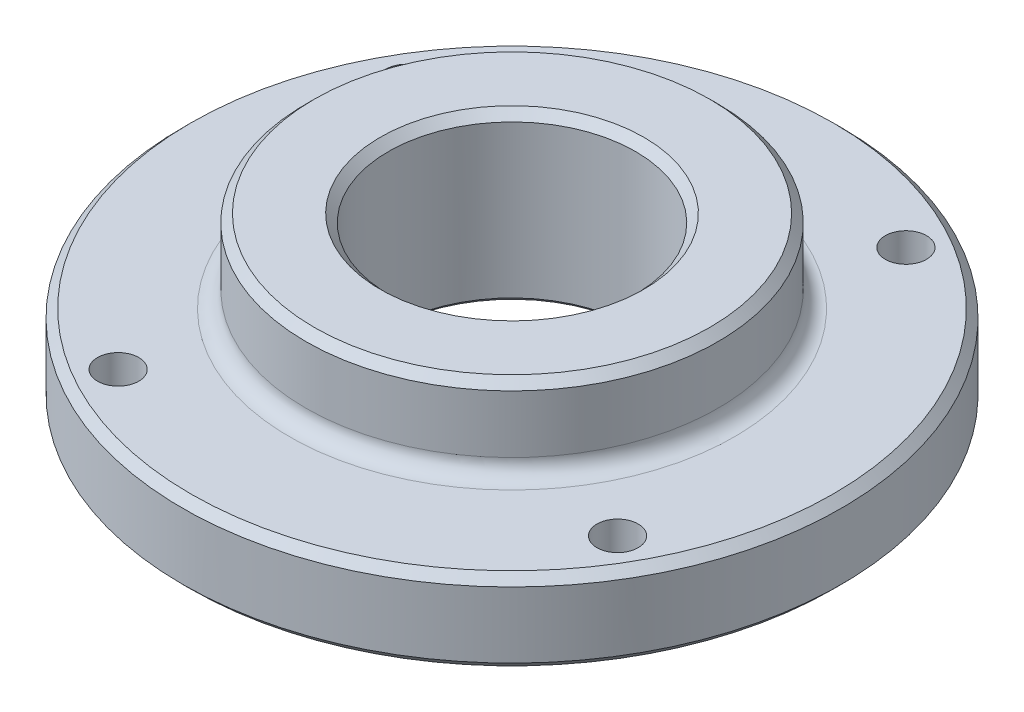
ISO-10303-21;
HEADER;
FILE_DESCRIPTION(('STEP AP214'),'2;1');
FILE_NAME('part.step','',(''),(''),'','','');
FILE_SCHEMA(('AUTOMOTIVE_DESIGN { 1 0 10303 214 1 1 1 1 }'));
ENDSEC;
DATA;
#1=APPLICATION_CONTEXT('core data for automotive mechanical design processes');
#2=APPLICATION_PROTOCOL_DEFINITION('international standard','automotive_design',2000,#1);
#3=PRODUCT_CONTEXT('',#1,'mechanical');
#4=PRODUCT('Part','Part','',(#3));
#5=PRODUCT_RELATED_PRODUCT_CATEGORY('part','',(#4));
#6=PRODUCT_DEFINITION_FORMATION('','',#4);
#7=PRODUCT_DEFINITION_CONTEXT('part definition',#1,'design');
#8=PRODUCT_DEFINITION('design','',#6,#7);
#9=PRODUCT_DEFINITION_SHAPE('','',#8);
#10=(LENGTH_UNIT() NAMED_UNIT(*) SI_UNIT(.MILLI.,.METRE.));
#11=(NAMED_UNIT(*) PLANE_ANGLE_UNIT() SI_UNIT($,.RADIAN.));
#12=(NAMED_UNIT(*) SI_UNIT($,.STERADIAN.) SOLID_ANGLE_UNIT());
#13=UNCERTAINTY_MEASURE_WITH_UNIT(LENGTH_MEASURE(1.E-05),#10,'distance_accuracy_value','');
#14=(GEOMETRIC_REPRESENTATION_CONTEXT(3) GLOBAL_UNCERTAINTY_ASSIGNED_CONTEXT((#13)) GLOBAL_UNIT_ASSIGNED_CONTEXT((#10,
#11,#12)) REPRESENTATION_CONTEXT('',''));
#15=CARTESIAN_POINT('',(0.,0.,0.));
#16=DIRECTION('',(0.,0.,1.));
#17=DIRECTION('',(1.,0.,0.));
#18=AXIS2_PLACEMENT_3D('',#15,#16,#17);
#19=CARTESIAN_POINT('',(-40.,0.,0.));
#20=DIRECTION('',(0.,1.,0.));
#21=DIRECTION('',(0.,0.,1.));
#22=AXIS2_PLACEMENT_3D('',#19,#20,#21);
#23=PLANE('',#22);
#24=CARTESIAN_POINT('',(0.,0.,0.));
#25=DIRECTION('',(0.,1.,0.));
#26=DIRECTION('',(0.,0.,1.));
#27=AXIS2_PLACEMENT_3D('',#24,#25,#26);
#28=CIRCLE('',#27,15.5);
#29=CARTESIAN_POINT('',(0.,0.,15.5));
#30=VERTEX_POINT('',#29);
#31=EDGE_CURVE('E10',#30,#30,#28,.T.);
#32=ORIENTED_EDGE('',*,*,#31,.T.);
#33=EDGE_LOOP('',(#32));
#34=FACE_BOUND('',#33,.T.);
#35=CARTESIAN_POINT('',(0.,0.,0.));
#36=DIRECTION('',(0.,1.,0.));
#37=DIRECTION('',(0.,0.,1.));
#38=AXIS2_PLACEMENT_3D('',#35,#36,#37);
#39=CIRCLE('',#38,39.);
#40=CARTESIAN_POINT('',(0.,0.,39.));
#41=VERTEX_POINT('',#40);
#42=EDGE_CURVE('E67',#41,#41,#39,.F.);
#43=ORIENTED_EDGE('',*,*,#42,.T.);
#44=EDGE_LOOP('',(#43));
#45=FACE_BOUND('',#44,.T.);
#46=CARTESIAN_POINT('',(17.5,0.,-30.3108891324553));
#47=DIRECTION('',(0.,1.,0.));
#48=DIRECTION('',(0.,0.,1.));
#49=AXIS2_PLACEMENT_3D('',#46,#47,#48);
#50=CIRCLE('',#49,2.5);
#51=CARTESIAN_POINT('',(17.5,0.,-27.8108891324553));
#52=VERTEX_POINT('',#51);
#53=EDGE_CURVE('E99',#52,#52,#50,.F.);
#54=ORIENTED_EDGE('',*,*,#53,.F.);
#55=EDGE_LOOP('',(#54));
#56=FACE_BOUND('',#55,.T.);
#57=CARTESIAN_POINT('',(30.3108891324567,0.,17.4999999999997));
#58=DIRECTION('',(0.,1.,0.));
#59=DIRECTION('',(0.,0.,1.));
#60=AXIS2_PLACEMENT_3D('',#57,#58,#59);
#61=CIRCLE('',#60,2.50000000000005);
#62=CARTESIAN_POINT('',(30.3108891324567,0.,19.9999999999997));
#63=VERTEX_POINT('',#62);
#64=EDGE_CURVE('E113',#63,#63,#61,.F.);
#65=ORIENTED_EDGE('',*,*,#64,.F.);
#66=EDGE_LOOP('',(#65));
#67=FACE_BOUND('',#66,.T.);
#68=CARTESIAN_POINT('',(-17.4999999999983,0.,30.3108891324563));
#69=DIRECTION('',(0.,1.,0.));
#70=DIRECTION('',(0.,0.,1.));
#71=AXIS2_PLACEMENT_3D('',#68,#69,#70);
#72=CIRCLE('',#71,2.50000000000152);
#73=CARTESIAN_POINT('',(-17.4999999999983,0.,32.8108891324578));
#74=VERTEX_POINT('',#73);
#75=EDGE_CURVE('E104',#74,#74,#72,.F.);
#76=ORIENTED_EDGE('',*,*,#75,.F.);
#77=EDGE_LOOP('',(#76));
#78=FACE_BOUND('',#77,.T.);
#79=CARTESIAN_POINT('',(-30.310889132455,0.,-17.4999999999987));
#80=DIRECTION('',(0.,1.,0.));
#81=DIRECTION('',(0.,0.,1.));
#82=AXIS2_PLACEMENT_3D('',#79,#80,#81);
#83=CIRCLE('',#82,2.50000000000165);
#84=CARTESIAN_POINT('',(-30.310889132455,0.,-14.999999999997));
#85=VERTEX_POINT('',#84);
#86=EDGE_CURVE('E105',#85,#85,#83,.F.);
#87=ORIENTED_EDGE('',*,*,#86,.F.);
#88=EDGE_LOOP('',(#87));
#89=FACE_BOUND('',#88,.T.);
#90=ADVANCED_FACE('F42',(#34,#45,#56,#67,#78,#89),#23,.F.);
#91=CARTESIAN_POINT('',(0.,0.,0.));
#92=DIRECTION('',(0.,-1.,0.));
#93=DIRECTION('',(0.,0.,-1.));
#94=AXIS2_PLACEMENT_3D('',#91,#92,#93);
#95=CYLINDRICAL_SURFACE('',#94,15.);
#96=CARTESIAN_POINT('',(0.,0.499999999999999,0.));
#97=DIRECTION('',(0.,1.,0.));
#98=DIRECTION('',(0.,0.,1.));
#99=AXIS2_PLACEMENT_3D('',#96,#97,#98);
#100=CIRCLE('',#99,15.);
#101=CARTESIAN_POINT('',(0.,0.499999999999999,15.));
#102=VERTEX_POINT('',#101);
#103=EDGE_CURVE('E51',#102,#102,#100,.F.);
#104=ORIENTED_EDGE('',*,*,#103,.T.);
#105=EDGE_LOOP('',(#104));
#106=FACE_BOUND('',#105,.T.);
#107=CARTESIAN_POINT('',(0.,19.,0.));
#108=DIRECTION('',(0.,-1.,0.));
#109=DIRECTION('',(0.,0.,-1.));
#110=AXIS2_PLACEMENT_3D('',#107,#108,#109);
#111=CIRCLE('',#110,15.);
#112=CARTESIAN_POINT('',(0.,19.,-15.));
#113=VERTEX_POINT('',#112);
#114=EDGE_CURVE('E91',#113,#113,#111,.F.);
#115=ORIENTED_EDGE('',*,*,#114,.T.);
#116=EDGE_LOOP('',(#115));
#117=FACE_BOUND('',#116,.T.);
#118=ADVANCED_FACE('F157',(#106,#117),#95,.F.);
#119=CARTESIAN_POINT('',(-15.,20.,0.));
#120=DIRECTION('',(0.,-1.,0.));
#121=DIRECTION('',(0.,0.,-1.));
#122=AXIS2_PLACEMENT_3D('',#119,#120,#121);
#123=PLANE('',#122);
#124=CARTESIAN_POINT('',(0.,20.,0.));
#125=DIRECTION('',(0.,-1.,0.));
#126=DIRECTION('',(0.,0.,-1.));
#127=AXIS2_PLACEMENT_3D('',#124,#125,#126);
#128=CIRCLE('',#127,24.);
#129=CARTESIAN_POINT('',(0.,20.,-24.));
#130=VERTEX_POINT('',#129);
#131=EDGE_CURVE('E56',#130,#130,#128,.F.);
#132=ORIENTED_EDGE('',*,*,#131,.T.);
#133=EDGE_LOOP('',(#132));
#134=FACE_BOUND('',#133,.T.);
#135=CARTESIAN_POINT('',(0.,20.,0.));
#136=DIRECTION('',(0.,-1.,0.));
#137=DIRECTION('',(0.,0.,-1.));
#138=AXIS2_PLACEMENT_3D('',#135,#136,#137);
#139=CIRCLE('',#138,16.);
#140=CARTESIAN_POINT('',(0.,20.,-16.));
#141=VERTEX_POINT('',#140);
#142=EDGE_CURVE('E95',#141,#141,#139,.T.);
#143=ORIENTED_EDGE('',*,*,#142,.T.);
#144=EDGE_LOOP('',(#143));
#145=FACE_BOUND('',#144,.T.);
#146=ADVANCED_FACE('F162',(#134,#145),#123,.F.);
#147=CARTESIAN_POINT('',(0.,0.,0.));
#148=DIRECTION('',(0.,-1.,0.));
#149=DIRECTION('',(0.,0.,-1.));
#150=AXIS2_PLACEMENT_3D('',#147,#148,#149);
#151=CYLINDRICAL_SURFACE('',#150,25.);
#152=CARTESIAN_POINT('',(0.,19.,0.));
#153=DIRECTION('',(0.,-1.,0.));
#154=DIRECTION('',(0.,0.,-1.));
#155=AXIS2_PLACEMENT_3D('',#152,#153,#154);
#156=CIRCLE('',#155,25.);
#157=CARTESIAN_POINT('',(0.,19.,-25.));
#158=VERTEX_POINT('',#157);
#159=EDGE_CURVE('E61',#158,#158,#156,.T.);
#160=ORIENTED_EDGE('',*,*,#159,.T.);
#161=EDGE_LOOP('',(#160));
#162=FACE_BOUND('',#161,.T.);
#163=CARTESIAN_POINT('',(0.,12.,0.));
#164=DIRECTION('',(0.,-1.,0.));
#165=DIRECTION('',(0.,0.,-1.));
#166=AXIS2_PLACEMENT_3D('',#163,#164,#165);
#167=CIRCLE('',#166,25.);
#168=CARTESIAN_POINT('',(0.,12.,-25.));
#169=VERTEX_POINT('',#168);
#170=EDGE_CURVE('E83',#169,#169,#167,.F.);
#171=ORIENTED_EDGE('',*,*,#170,.T.);
#172=EDGE_LOOP('',(#171));
#173=FACE_BOUND('',#172,.T.);
#174=ADVANCED_FACE('F139',(#162,#173),#151,.T.);
#175=CARTESIAN_POINT('',(-25.,10.,0.));
#176=DIRECTION('',(0.,-1.,0.));
#177=DIRECTION('',(0.,0.,-1.));
#178=AXIS2_PLACEMENT_3D('',#175,#176,#177);
#179=PLANE('',#178);
#180=CARTESIAN_POINT('',(0.,10.,0.));
#181=DIRECTION('',(0.,-1.,0.));
#182=DIRECTION('',(0.,0.,-1.));
#183=AXIS2_PLACEMENT_3D('',#180,#181,#182);
#184=CIRCLE('',#183,39.);
#185=CARTESIAN_POINT('',(0.,10.,-39.));
#186=VERTEX_POINT('',#185);
#187=EDGE_CURVE('E71',#186,#186,#184,.F.);
#188=ORIENTED_EDGE('',*,*,#187,.T.);
#189=EDGE_LOOP('',(#188));
#190=FACE_BOUND('',#189,.T.);
#191=CARTESIAN_POINT('',(0.,10.,0.));
#192=DIRECTION('',(0.,-1.,0.));
#193=DIRECTION('',(0.,0.,-1.));
#194=AXIS2_PLACEMENT_3D('',#191,#192,#193);
#195=CIRCLE('',#194,27.);
#196=CARTESIAN_POINT('',(0.,10.,-27.));
#197=VERTEX_POINT('',#196);
#198=EDGE_CURVE('E87',#197,#197,#195,.T.);
#199=ORIENTED_EDGE('',*,*,#198,.T.);
#200=EDGE_LOOP('',(#199));
#201=FACE_BOUND('',#200,.T.);
#202=CARTESIAN_POINT('',(17.5,10.,-30.3108891324553));
#203=DIRECTION('',(0.,1.,0.));
#204=DIRECTION('',(0.,0.,1.));
#205=AXIS2_PLACEMENT_3D('',#202,#203,#204);
#206=CIRCLE('',#205,2.5);
#207=CARTESIAN_POINT('',(17.5,10.,-27.8108891324553));
#208=VERTEX_POINT('',#207);
#209=EDGE_CURVE('E121',#208,#208,#206,.T.);
#210=ORIENTED_EDGE('',*,*,#209,.F.);
#211=EDGE_LOOP('',(#210));
#212=FACE_BOUND('',#211,.T.);
#213=CARTESIAN_POINT('',(30.3108891324567,10.,17.4999999999997));
#214=DIRECTION('',(0.,1.,0.));
#215=DIRECTION('',(0.,0.,1.));
#216=AXIS2_PLACEMENT_3D('',#213,#214,#215);
#217=CIRCLE('',#216,2.50000000000005);
#218=CARTESIAN_POINT('',(30.3108891324567,10.,19.9999999999997));
#219=VERTEX_POINT('',#218);
#220=EDGE_CURVE('E117',#219,#219,#217,.T.);
#221=ORIENTED_EDGE('',*,*,#220,.F.);
#222=EDGE_LOOP('',(#221));
#223=FACE_BOUND('',#222,.T.);
#224=CARTESIAN_POINT('',(-17.4999999999983,10.,30.3108891324563));
#225=DIRECTION('',(0.,1.,0.));
#226=DIRECTION('',(0.,0.,1.));
#227=AXIS2_PLACEMENT_3D('',#224,#225,#226);
#228=CIRCLE('',#227,2.50000000000152);
#229=CARTESIAN_POINT('',(-17.4999999999983,10.,32.8108891324578));
#230=VERTEX_POINT('',#229);
#231=EDGE_CURVE('E109',#230,#230,#228,.T.);
#232=ORIENTED_EDGE('',*,*,#231,.F.);
#233=EDGE_LOOP('',(#232));
#234=FACE_BOUND('',#233,.T.);
#235=CARTESIAN_POINT('',(-30.310889132455,10.,-17.4999999999987));
#236=DIRECTION('',(0.,1.,0.));
#237=DIRECTION('',(0.,0.,1.));
#238=AXIS2_PLACEMENT_3D('',#235,#236,#237);
#239=CIRCLE('',#238,2.50000000000165);
#240=CARTESIAN_POINT('',(-30.310889132455,10.,-14.999999999997));
#241=VERTEX_POINT('',#240);
#242=EDGE_CURVE('E100',#241,#241,#239,.T.);
#243=ORIENTED_EDGE('',*,*,#242,.F.);
#244=EDGE_LOOP('',(#243));
#245=FACE_BOUND('',#244,.T.);
#246=ADVANCED_FACE('F135',(#190,#201,#212,#223,#234,#245),#179,.F.);
#247=CARTESIAN_POINT('',(0.,0.,0.));
#248=DIRECTION('',(0.,-1.,0.));
#249=DIRECTION('',(0.,0.,-1.));
#250=AXIS2_PLACEMENT_3D('',#247,#248,#249);
#251=CYLINDRICAL_SURFACE('',#250,40.);
#252=CARTESIAN_POINT('',(0.,9.00000000000001,0.));
#253=DIRECTION('',(0.,-1.,0.));
#254=DIRECTION('',(0.,0.,-1.));
#255=AXIS2_PLACEMENT_3D('',#252,#253,#254);
#256=CIRCLE('',#255,40.);
#257=CARTESIAN_POINT('',(0.,9.00000000000001,-40.));
#258=VERTEX_POINT('',#257);
#259=EDGE_CURVE('E75',#258,#258,#256,.T.);
#260=ORIENTED_EDGE('',*,*,#259,.T.);
#261=EDGE_LOOP('',(#260));
#262=FACE_BOUND('',#261,.T.);
#263=CARTESIAN_POINT('',(0.,1.00000000000002,0.));
#264=DIRECTION('',(0.,1.,0.));
#265=DIRECTION('',(0.,0.,1.));
#266=AXIS2_PLACEMENT_3D('',#263,#264,#265);
#267=CIRCLE('',#266,40.);
#268=CARTESIAN_POINT('',(0.,1.00000000000002,40.));
#269=VERTEX_POINT('',#268);
#270=EDGE_CURVE('E79',#269,#269,#267,.T.);
#271=ORIENTED_EDGE('',*,*,#270,.T.);
#272=EDGE_LOOP('',(#271));
#273=FACE_BOUND('',#272,.T.);
#274=ADVANCED_FACE('F138',(#262,#273),#251,.T.);
#275=CARTESIAN_POINT('',(0.,20.,0.));
#276=DIRECTION('',(0.,1.,0.));
#277=DIRECTION('',(0.,0.,1.));
#278=AXIS2_PLACEMENT_3D('',#275,#276,#277);
#279=CONICAL_SURFACE('',#278,16.,0.785398163397453);
#280=ORIENTED_EDGE('',*,*,#114,.F.);
#281=EDGE_LOOP('',(#280));
#282=FACE_BOUND('',#281,.T.);
#283=ORIENTED_EDGE('',*,*,#142,.F.);
#284=EDGE_LOOP('',(#283));
#285=FACE_BOUND('',#284,.T.);
#286=ADVANCED_FACE('F152',(#282,#285),#279,.F.);
#287=CARTESIAN_POINT('',(-30.310889132455,-0.000999999999999265,-17.4999999999987));
#288=DIRECTION('',(0.,1.,0.));
#289=DIRECTION('',(0.,0.,1.));
#290=AXIS2_PLACEMENT_3D('',#287,#288,#289);
#291=CYLINDRICAL_SURFACE('',#290,2.50000000000165);
#292=ORIENTED_EDGE('',*,*,#242,.T.);
#293=EDGE_LOOP('',(#292));
#294=FACE_BOUND('',#293,.T.);
#295=ORIENTED_EDGE('',*,*,#86,.T.);
#296=EDGE_LOOP('',(#295));
#297=FACE_BOUND('',#296,.T.);
#298=ADVANCED_FACE('F148',(#294,#297),#291,.F.);
#299=CARTESIAN_POINT('',(-17.4999999999983,-0.000999999999999265,30.3108891324563));
#300=DIRECTION('',(0.,1.,0.));
#301=DIRECTION('',(0.,0.,1.));
#302=AXIS2_PLACEMENT_3D('',#299,#300,#301);
#303=CYLINDRICAL_SURFACE('',#302,2.50000000000152);
#304=ORIENTED_EDGE('',*,*,#231,.T.);
#305=EDGE_LOOP('',(#304));
#306=FACE_BOUND('',#305,.T.);
#307=ORIENTED_EDGE('',*,*,#75,.T.);
#308=EDGE_LOOP('',(#307));
#309=FACE_BOUND('',#308,.T.);
#310=ADVANCED_FACE('F151',(#306,#309),#303,.F.);
#311=CARTESIAN_POINT('',(30.3108891324567,-0.000999999999999265,17.4999999999997));
#312=DIRECTION('',(0.,1.,0.));
#313=DIRECTION('',(0.,0.,1.));
#314=AXIS2_PLACEMENT_3D('',#311,#312,#313);
#315=CYLINDRICAL_SURFACE('',#314,2.50000000000005);
#316=ORIENTED_EDGE('',*,*,#220,.T.);
#317=EDGE_LOOP('',(#316));
#318=FACE_BOUND('',#317,.T.);
#319=ORIENTED_EDGE('',*,*,#64,.T.);
#320=EDGE_LOOP('',(#319));
#321=FACE_BOUND('',#320,.T.);
#322=ADVANCED_FACE('F221',(#318,#321),#315,.F.);
#323=CARTESIAN_POINT('',(17.5,-0.000999999999999265,-30.3108891324553));
#324=DIRECTION('',(0.,1.,0.));
#325=DIRECTION('',(0.,0.,1.));
#326=AXIS2_PLACEMENT_3D('',#323,#324,#325);
#327=CYLINDRICAL_SURFACE('',#326,2.5);
#328=ORIENTED_EDGE('',*,*,#209,.T.);
#329=EDGE_LOOP('',(#328));
#330=FACE_BOUND('',#329,.T.);
#331=ORIENTED_EDGE('',*,*,#53,.T.);
#332=EDGE_LOOP('',(#331));
#333=FACE_BOUND('',#332,.T.);
#334=ADVANCED_FACE('F132',(#330,#333),#327,.F.);
#335=CARTESIAN_POINT('',(0.,12.,0.));
#336=DIRECTION('',(0.,-1.,0.));
#337=DIRECTION('',(0.,0.,-1.));
#338=AXIS2_PLACEMENT_3D('',#335,#336,#337);
#339=TOROIDAL_SURFACE('',#338,27.,2.);
#340=ORIENTED_EDGE('',*,*,#170,.F.);
#341=EDGE_LOOP('',(#340));
#342=FACE_BOUND('',#341,.T.);
#343=ORIENTED_EDGE('',*,*,#198,.F.);
#344=EDGE_LOOP('',(#343));
#345=FACE_BOUND('',#344,.T.);
#346=ADVANCED_FACE('F174',(#342,#345),#339,.F.);
#347=CARTESIAN_POINT('',(0.,9.00000000000001,0.));
#348=DIRECTION('',(0.,-1.,0.));
#349=DIRECTION('',(0.,0.,-1.));
#350=AXIS2_PLACEMENT_3D('',#347,#348,#349);
#351=CONICAL_SURFACE('',#350,40.,0.785398163397452);
#352=ORIENTED_EDGE('',*,*,#187,.F.);
#353=EDGE_LOOP('',(#352));
#354=FACE_BOUND('',#353,.T.);
#355=ORIENTED_EDGE('',*,*,#259,.F.);
#356=EDGE_LOOP('',(#355));
#357=FACE_BOUND('',#356,.T.);
#358=ADVANCED_FACE('F177',(#354,#357),#351,.T.);
#359=CARTESIAN_POINT('',(0.,0.,0.));
#360=DIRECTION('',(0.,1.,0.));
#361=DIRECTION('',(0.,0.,1.));
#362=AXIS2_PLACEMENT_3D('',#359,#360,#361);
#363=CONICAL_SURFACE('',#362,39.,0.785398163397441);
#364=ORIENTED_EDGE('',*,*,#270,.F.);
#365=EDGE_LOOP('',(#364));
#366=FACE_BOUND('',#365,.T.);
#367=ORIENTED_EDGE('',*,*,#42,.F.);
#368=EDGE_LOOP('',(#367));
#369=FACE_BOUND('',#368,.T.);
#370=ADVANCED_FACE('F184',(#366,#369),#363,.T.);
#371=CARTESIAN_POINT('',(0.,19.,0.));
#372=DIRECTION('',(0.,-1.,0.));
#373=DIRECTION('',(0.,0.,-1.));
#374=AXIS2_PLACEMENT_3D('',#371,#372,#373);
#375=CONICAL_SURFACE('',#374,25.,0.785398163397454);
#376=ORIENTED_EDGE('',*,*,#131,.F.);
#377=EDGE_LOOP('',(#376));
#378=FACE_BOUND('',#377,.T.);
#379=ORIENTED_EDGE('',*,*,#159,.F.);
#380=EDGE_LOOP('',(#379));
#381=FACE_BOUND('',#380,.T.);
#382=ADVANCED_FACE('F190',(#378,#381),#375,.T.);
#383=CARTESIAN_POINT('',(0.,0.499999999999999,0.));
#384=DIRECTION('',(0.,-1.,0.));
#385=DIRECTION('',(0.,0.,-1.));
#386=AXIS2_PLACEMENT_3D('',#383,#384,#385);
#387=CONICAL_SURFACE('',#386,15.,0.785398163397452);
#388=ORIENTED_EDGE('',*,*,#31,.F.);
#389=EDGE_LOOP('',(#388));
#390=FACE_BOUND('',#389,.T.);
#391=ORIENTED_EDGE('',*,*,#103,.F.);
#392=EDGE_LOOP('',(#391));
#393=FACE_BOUND('',#392,.T.);
#394=ADVANCED_FACE('F45',(#390,#393),#387,.F.);
#395=CLOSED_SHELL('',(#90,#118,#146,#174,#246,#274,#286,#298,#310,#322,#334,#346,#358,#370,#382,#394));
#396=MANIFOLD_SOLID_BREP('B2',#395);
#397=ADVANCED_BREP_SHAPE_REPRESENTATION('',(#18,#396),#14);
#398=SHAPE_DEFINITION_REPRESENTATION(#9,#397);
ENDSEC;
END-ISO-10303-21;
